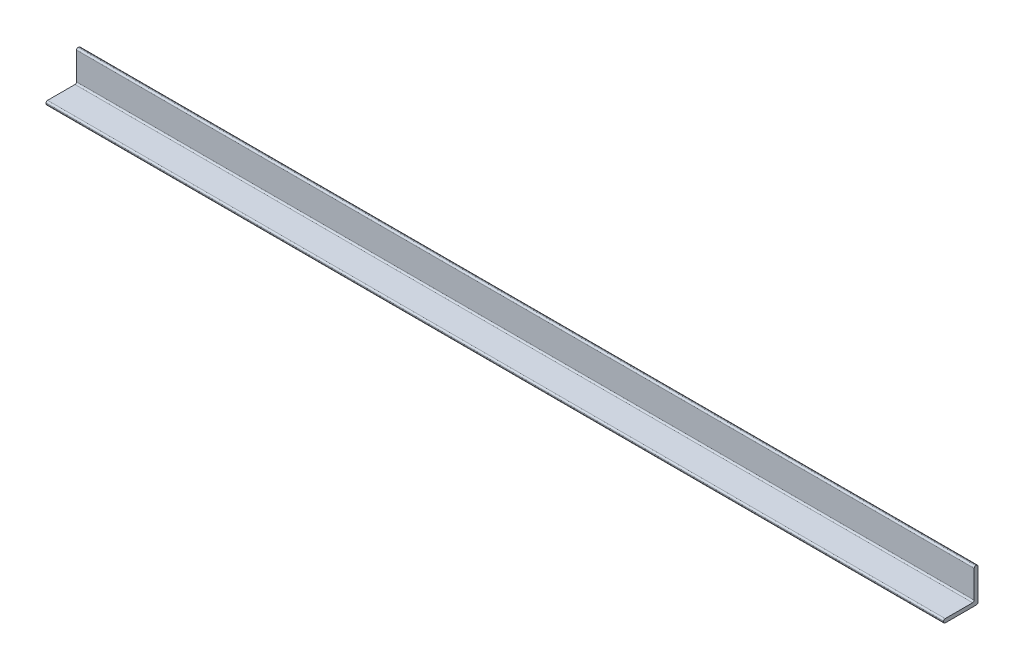
ISO-10303-21;
HEADER;
FILE_DESCRIPTION(('STEP AP214'),'2;1');
FILE_NAME('part.step','',(''),(''),'','','');
FILE_SCHEMA(('AUTOMOTIVE_DESIGN { 1 0 10303 214 1 1 1 1 }'));
ENDSEC;
DATA;
#1=APPLICATION_CONTEXT('core data for automotive mechanical design processes');
#2=APPLICATION_PROTOCOL_DEFINITION('international standard','automotive_design',2000,#1);
#3=PRODUCT_CONTEXT('',#1,'mechanical');
#4=PRODUCT('Part','Part','',(#3));
#5=PRODUCT_RELATED_PRODUCT_CATEGORY('part','',(#4));
#6=PRODUCT_DEFINITION_FORMATION('','',#4);
#7=PRODUCT_DEFINITION_CONTEXT('part definition',#1,'design');
#8=PRODUCT_DEFINITION('design','',#6,#7);
#9=PRODUCT_DEFINITION_SHAPE('','',#8);
#10=(LENGTH_UNIT() NAMED_UNIT(*) SI_UNIT(.MILLI.,.METRE.));
#11=(NAMED_UNIT(*) PLANE_ANGLE_UNIT() SI_UNIT($,.RADIAN.));
#12=(NAMED_UNIT(*) SI_UNIT($,.STERADIAN.) SOLID_ANGLE_UNIT());
#13=UNCERTAINTY_MEASURE_WITH_UNIT(LENGTH_MEASURE(1.E-05),#10,'distance_accuracy_value','');
#14=(GEOMETRIC_REPRESENTATION_CONTEXT(3) GLOBAL_UNCERTAINTY_ASSIGNED_CONTEXT((#13)) GLOBAL_UNIT_ASSIGNED_CONTEXT((#10,
#11,#12)) REPRESENTATION_CONTEXT('',''));
#15=CARTESIAN_POINT('',(0.,0.,0.));
#16=DIRECTION('',(0.,0.,1.));
#17=DIRECTION('',(1.,0.,0.));
#18=AXIS2_PLACEMENT_3D('',#15,#16,#17);
#19=CARTESIAN_POINT('',(294.,2.5,-11.25));
#20=DIRECTION('',(-1.,0.,0.));
#21=DIRECTION('',(0.,0.,1.));
#22=AXIS2_PLACEMENT_3D('',#19,#20,#21);
#23=PLANE('',#22);
#24=DIRECTION('',(0.,0.,-1.));
#25=VECTOR('',#24,1.);
#26=CARTESIAN_POINT('',(294.,0.,-11.25));
#27=LINE('',#26,#25);
#28=CARTESIAN_POINT('',(294.,0.,10.25));
#29=VERTEX_POINT('',#28);
#30=CARTESIAN_POINT('',(294.,0.,-10.25));
#31=VERTEX_POINT('',#30);
#32=EDGE_CURVE('E213',#29,#31,#27,.T.);
#33=ORIENTED_EDGE('',*,*,#32,.T.);
#34=CARTESIAN_POINT('',(294.,1.,-10.25));
#35=DIRECTION('',(-1.,0.,0.));
#36=DIRECTION('',(0.,0.,1.));
#37=AXIS2_PLACEMENT_3D('',#34,#35,#36);
#38=CIRCLE('',#37,1.);
#39=CARTESIAN_POINT('',(294.,1.,-11.25));
#40=VERTEX_POINT('',#39);
#41=EDGE_CURVE('E167',#31,#40,#38,.F.);
#42=ORIENTED_EDGE('',*,*,#41,.T.);
#43=DIRECTION('',(0.,-1.,0.));
#44=VECTOR('',#43,1.);
#45=CARTESIAN_POINT('',(294.,2.5,-11.25));
#46=LINE('',#45,#44);
#47=CARTESIAN_POINT('',(294.,21.5,-11.25));
#48=VERTEX_POINT('',#47);
#49=EDGE_CURVE('E142',#48,#40,#46,.T.);
#50=ORIENTED_EDGE('',*,*,#49,.F.);
#51=CARTESIAN_POINT('',(294.,21.5,-10.25));
#52=DIRECTION('',(-1.,0.,0.));
#53=DIRECTION('',(0.,0.,1.));
#54=AXIS2_PLACEMENT_3D('',#51,#52,#53);
#55=CIRCLE('',#54,1.);
#56=CARTESIAN_POINT('',(294.,22.5,-10.25));
#57=VERTEX_POINT('',#56);
#58=EDGE_CURVE('E146',#48,#57,#55,.F.);
#59=ORIENTED_EDGE('',*,*,#58,.T.);
#60=DIRECTION('',(0.,0.,-1.));
#61=VECTOR('',#60,1.);
#62=CARTESIAN_POINT('',(294.,22.5,-11.25));
#63=LINE('',#62,#61);
#64=CARTESIAN_POINT('',(294.,22.5,-9.75));
#65=VERTEX_POINT('',#64);
#66=EDGE_CURVE('E216',#65,#57,#63,.T.);
#67=ORIENTED_EDGE('',*,*,#66,.F.);
#68=CARTESIAN_POINT('',(294.,21.5,-9.75));
#69=DIRECTION('',(-1.,0.,0.));
#70=DIRECTION('',(0.,0.,1.));
#71=AXIS2_PLACEMENT_3D('',#68,#69,#70);
#72=CIRCLE('',#71,1.);
#73=CARTESIAN_POINT('',(294.,21.5,-8.75));
#74=VERTEX_POINT('',#73);
#75=EDGE_CURVE('E163',#65,#74,#72,.F.);
#76=ORIENTED_EDGE('',*,*,#75,.T.);
#77=DIRECTION('',(0.,-1.,0.));
#78=VECTOR('',#77,1.);
#79=CARTESIAN_POINT('',(294.,22.5,-8.75));
#80=LINE('',#79,#78);
#81=CARTESIAN_POINT('',(294.,3.5,-8.75));
#82=VERTEX_POINT('',#81);
#83=EDGE_CURVE('E192',#74,#82,#80,.T.);
#84=ORIENTED_EDGE('',*,*,#83,.T.);
#85=CARTESIAN_POINT('',(294.,3.5,-7.75));
#86=DIRECTION('',(-1.,0.,0.));
#87=DIRECTION('',(0.,0.,1.));
#88=AXIS2_PLACEMENT_3D('',#85,#86,#87);
#89=CIRCLE('',#88,1.);
#90=CARTESIAN_POINT('',(294.,2.5,-7.75));
#91=VERTEX_POINT('',#90);
#92=EDGE_CURVE('E40',#82,#91,#89,.T.);
#93=ORIENTED_EDGE('',*,*,#92,.T.);
#94=DIRECTION('',(0.,0.,-1.));
#95=VECTOR('',#94,1.);
#96=CARTESIAN_POINT('',(294.,2.5,-11.25));
#97=LINE('',#96,#95);
#98=CARTESIAN_POINT('',(294.,2.5,10.25));
#99=VERTEX_POINT('',#98);
#100=EDGE_CURVE('E190',#99,#91,#97,.T.);
#101=ORIENTED_EDGE('',*,*,#100,.F.);
#102=CARTESIAN_POINT('',(294.,1.5,10.25));
#103=DIRECTION('',(-1.,0.,0.));
#104=DIRECTION('',(0.,0.,1.));
#105=AXIS2_PLACEMENT_3D('',#102,#103,#104);
#106=CIRCLE('',#105,1.);
#107=CARTESIAN_POINT('',(294.,1.5,11.25));
#108=VERTEX_POINT('',#107);
#109=EDGE_CURVE('E55',#99,#108,#106,.F.);
#110=ORIENTED_EDGE('',*,*,#109,.T.);
#111=DIRECTION('',(0.,-1.,0.));
#112=VECTOR('',#111,1.);
#113=CARTESIAN_POINT('',(294.,2.5,11.25));
#114=LINE('',#113,#112);
#115=CARTESIAN_POINT('',(294.,1.,11.25));
#116=VERTEX_POINT('',#115);
#117=EDGE_CURVE('E220',#108,#116,#114,.T.);
#118=ORIENTED_EDGE('',*,*,#117,.T.);
#119=CARTESIAN_POINT('',(294.,1.,10.25));
#120=DIRECTION('',(-1.,0.,0.));
#121=DIRECTION('',(0.,0.,1.));
#122=AXIS2_PLACEMENT_3D('',#119,#120,#121);
#123=CIRCLE('',#122,1.);
#124=EDGE_CURVE('E47',#116,#29,#123,.F.);
#125=ORIENTED_EDGE('',*,*,#124,.T.);
#126=EDGE_LOOP('',(#33,#42,#50,#59,#67,#76,#84,#93,#101,#110,#118,#125));
#127=FACE_BOUND('',#126,.T.);
#128=ADVANCED_FACE('F32',(#127),#23,.F.);
#129=CARTESIAN_POINT('',(-294.,2.5,-11.25));
#130=DIRECTION('',(0.,0.,1.));
#131=DIRECTION('',(1.,0.,0.));
#132=AXIS2_PLACEMENT_3D('',#129,#130,#131);
#133=PLANE('',#132);
#134=ORIENTED_EDGE('',*,*,#49,.T.);
#135=DIRECTION('',(-1.,0.,0.));
#136=VECTOR('',#135,1.);
#137=CARTESIAN_POINT('',(-294.,1.,-11.25));
#138=LINE('',#137,#136);
#139=CARTESIAN_POINT('',(-294.,1.,-11.25));
#140=VERTEX_POINT('',#139);
#141=EDGE_CURVE('E133',#40,#140,#138,.T.);
#142=ORIENTED_EDGE('',*,*,#141,.T.);
#143=DIRECTION('',(0.,-1.,0.));
#144=VECTOR('',#143,1.);
#145=CARTESIAN_POINT('',(-294.,2.5,-11.25));
#146=LINE('',#145,#144);
#147=CARTESIAN_POINT('',(-294.,21.5,-11.25));
#148=VERTEX_POINT('',#147);
#149=EDGE_CURVE('E125',#148,#140,#146,.T.);
#150=ORIENTED_EDGE('',*,*,#149,.F.);
#151=DIRECTION('',(-1.,0.,0.));
#152=VECTOR('',#151,1.);
#153=CARTESIAN_POINT('',(294.,21.5,-11.25));
#154=LINE('',#153,#152);
#155=EDGE_CURVE('E139',#148,#48,#154,.F.);
#156=ORIENTED_EDGE('',*,*,#155,.T.);
#157=EDGE_LOOP('',(#134,#142,#150,#156));
#158=FACE_BOUND('',#157,.T.);
#159=ADVANCED_FACE('F138',(#158),#133,.F.);
#160=CARTESIAN_POINT('',(-294.,2.5,-11.25));
#161=DIRECTION('',(1.,0.,0.));
#162=DIRECTION('',(0.,0.,-1.));
#163=AXIS2_PLACEMENT_3D('',#160,#161,#162);
#164=PLANE('',#163);
#165=ORIENTED_EDGE('',*,*,#149,.T.);
#166=CARTESIAN_POINT('',(-294.,1.,-10.25));
#167=DIRECTION('',(1.,0.,0.));
#168=DIRECTION('',(0.,0.,-1.));
#169=AXIS2_PLACEMENT_3D('',#166,#167,#168);
#170=CIRCLE('',#169,1.);
#171=CARTESIAN_POINT('',(-294.,0.,-10.25));
#172=VERTEX_POINT('',#171);
#173=EDGE_CURVE('E156',#140,#172,#170,.F.);
#174=ORIENTED_EDGE('',*,*,#173,.T.);
#175=DIRECTION('',(0.,0.,1.));
#176=VECTOR('',#175,1.);
#177=CARTESIAN_POINT('',(-294.,0.,-11.25));
#178=LINE('',#177,#176);
#179=CARTESIAN_POINT('',(-294.,0.,10.25));
#180=VERTEX_POINT('',#179);
#181=EDGE_CURVE('E202',#172,#180,#178,.T.);
#182=ORIENTED_EDGE('',*,*,#181,.T.);
#183=CARTESIAN_POINT('',(-294.,1.,10.25));
#184=DIRECTION('',(1.,0.,0.));
#185=DIRECTION('',(0.,0.,-1.));
#186=AXIS2_PLACEMENT_3D('',#183,#184,#185);
#187=CIRCLE('',#186,1.);
#188=CARTESIAN_POINT('',(-294.,1.,11.25));
#189=VERTEX_POINT('',#188);
#190=EDGE_CURVE('E154',#180,#189,#187,.F.);
#191=ORIENTED_EDGE('',*,*,#190,.T.);
#192=DIRECTION('',(0.,-1.,0.));
#193=VECTOR('',#192,1.);
#194=CARTESIAN_POINT('',(-294.,2.5,11.25));
#195=LINE('',#194,#193);
#196=CARTESIAN_POINT('',(-294.,1.5,11.25));
#197=VERTEX_POINT('',#196);
#198=EDGE_CURVE('E143',#197,#189,#195,.T.);
#199=ORIENTED_EDGE('',*,*,#198,.F.);
#200=CARTESIAN_POINT('',(-294.,1.5,10.25));
#201=DIRECTION('',(1.,0.,0.));
#202=DIRECTION('',(0.,0.,-1.));
#203=AXIS2_PLACEMENT_3D('',#200,#201,#202);
#204=CIRCLE('',#203,1.);
#205=CARTESIAN_POINT('',(-294.,2.5,10.25));
#206=VERTEX_POINT('',#205);
#207=EDGE_CURVE('E152',#197,#206,#204,.F.);
#208=ORIENTED_EDGE('',*,*,#207,.T.);
#209=DIRECTION('',(0.,0.,1.));
#210=VECTOR('',#209,1.);
#211=CARTESIAN_POINT('',(-294.,2.5,-11.25));
#212=LINE('',#211,#210);
#213=CARTESIAN_POINT('',(-294.,2.5,-7.75));
#214=VERTEX_POINT('',#213);
#215=EDGE_CURVE('E201',#214,#206,#212,.T.);
#216=ORIENTED_EDGE('',*,*,#215,.F.);
#217=CARTESIAN_POINT('',(-294.,3.5,-7.75));
#218=DIRECTION('',(1.,0.,0.));
#219=DIRECTION('',(0.,0.,-1.));
#220=AXIS2_PLACEMENT_3D('',#217,#218,#219);
#221=CIRCLE('',#220,1.);
#222=CARTESIAN_POINT('',(-294.,3.5,-8.75));
#223=VERTEX_POINT('',#222);
#224=EDGE_CURVE('E11',#214,#223,#221,.T.);
#225=ORIENTED_EDGE('',*,*,#224,.T.);
#226=DIRECTION('',(0.,-1.,0.));
#227=VECTOR('',#226,1.);
#228=CARTESIAN_POINT('',(-294.,22.5,-8.75));
#229=LINE('',#228,#227);
#230=CARTESIAN_POINT('',(-294.,21.5,-8.75));
#231=VERTEX_POINT('',#230);
#232=EDGE_CURVE('E208',#231,#223,#229,.T.);
#233=ORIENTED_EDGE('',*,*,#232,.F.);
#234=CARTESIAN_POINT('',(-294.,21.5,-9.75));
#235=DIRECTION('',(1.,0.,0.));
#236=DIRECTION('',(0.,0.,-1.));
#237=AXIS2_PLACEMENT_3D('',#234,#235,#236);
#238=CIRCLE('',#237,1.);
#239=CARTESIAN_POINT('',(-294.,22.5,-9.75));
#240=VERTEX_POINT('',#239);
#241=EDGE_CURVE('E132',#231,#240,#238,.F.);
#242=ORIENTED_EDGE('',*,*,#241,.T.);
#243=DIRECTION('',(0.,0.,1.));
#244=VECTOR('',#243,1.);
#245=CARTESIAN_POINT('',(-294.,22.5,-11.25));
#246=LINE('',#245,#244);
#247=CARTESIAN_POINT('',(-294.,22.5,-10.25));
#248=VERTEX_POINT('',#247);
#249=EDGE_CURVE('E127',#248,#240,#246,.T.);
#250=ORIENTED_EDGE('',*,*,#249,.F.);
#251=CARTESIAN_POINT('',(-294.,21.5,-10.25));
#252=DIRECTION('',(1.,0.,0.));
#253=DIRECTION('',(0.,0.,-1.));
#254=AXIS2_PLACEMENT_3D('',#251,#252,#253);
#255=CIRCLE('',#254,1.);
#256=EDGE_CURVE('E122',#248,#148,#255,.F.);
#257=ORIENTED_EDGE('',*,*,#256,.T.);
#258=EDGE_LOOP('',(#165,#174,#182,#191,#199,#208,#216,#225,#233,#242,#250,#257));
#259=FACE_BOUND('',#258,.T.);
#260=ADVANCED_FACE('F124',(#259),#164,.F.);
#261=CARTESIAN_POINT('',(-294.,2.5,11.25));
#262=DIRECTION('',(0.,0.,-1.));
#263=DIRECTION('',(-1.,0.,0.));
#264=AXIS2_PLACEMENT_3D('',#261,#262,#263);
#265=PLANE('',#264);
#266=ORIENTED_EDGE('',*,*,#198,.T.);
#267=DIRECTION('',(1.,0.,0.));
#268=VECTOR('',#267,1.);
#269=CARTESIAN_POINT('',(-294.,1.,11.25));
#270=LINE('',#269,#268);
#271=EDGE_CURVE('E171',#189,#116,#270,.T.);
#272=ORIENTED_EDGE('',*,*,#271,.T.);
#273=ORIENTED_EDGE('',*,*,#117,.F.);
#274=DIRECTION('',(1.,0.,0.));
#275=VECTOR('',#274,1.);
#276=CARTESIAN_POINT('',(-294.,1.5,11.25));
#277=LINE('',#276,#275);
#278=EDGE_CURVE('E169',#108,#197,#277,.F.);
#279=ORIENTED_EDGE('',*,*,#278,.T.);
#280=EDGE_LOOP('',(#266,#272,#273,#279));
#281=FACE_BOUND('',#280,.T.);
#282=ADVANCED_FACE('F228',(#281),#265,.F.);
#283=CARTESIAN_POINT('',(0.,2.5,0.));
#284=DIRECTION('',(0.,1.,0.));
#285=DIRECTION('',(0.,0.,1.));
#286=AXIS2_PLACEMENT_3D('',#283,#284,#285);
#287=PLANE('',#286);
#288=ORIENTED_EDGE('',*,*,#215,.T.);
#289=DIRECTION('',(1.,0.,0.));
#290=VECTOR('',#289,1.);
#291=CARTESIAN_POINT('',(294.,2.5,10.25));
#292=LINE('',#291,#290);
#293=EDGE_CURVE('E175',#206,#99,#292,.T.);
#294=ORIENTED_EDGE('',*,*,#293,.T.);
#295=ORIENTED_EDGE('',*,*,#100,.T.);
#296=DIRECTION('',(1.,0.,0.));
#297=VECTOR('',#296,1.);
#298=CARTESIAN_POINT('',(0.,2.5,-7.75));
#299=LINE('',#298,#297);
#300=EDGE_CURVE('E173',#91,#214,#299,.F.);
#301=ORIENTED_EDGE('',*,*,#300,.T.);
#302=EDGE_LOOP('',(#288,#294,#295,#301));
#303=FACE_BOUND('',#302,.T.);
#304=ADVANCED_FACE('F198',(#303),#287,.T.);
#305=CARTESIAN_POINT('',(0.,0.,0.));
#306=DIRECTION('',(0.,1.,0.));
#307=DIRECTION('',(0.,0.,1.));
#308=AXIS2_PLACEMENT_3D('',#305,#306,#307);
#309=PLANE('',#308);
#310=ORIENTED_EDGE('',*,*,#181,.F.);
#311=DIRECTION('',(-1.,0.,0.));
#312=VECTOR('',#311,1.);
#313=CARTESIAN_POINT('',(0.,0.,-10.25));
#314=LINE('',#313,#312);
#315=EDGE_CURVE('E160',#172,#31,#314,.F.);
#316=ORIENTED_EDGE('',*,*,#315,.T.);
#317=ORIENTED_EDGE('',*,*,#32,.F.);
#318=DIRECTION('',(1.,0.,0.));
#319=VECTOR('',#318,1.);
#320=CARTESIAN_POINT('',(0.,0.,10.25));
#321=LINE('',#320,#319);
#322=EDGE_CURVE('E158',#29,#180,#321,.F.);
#323=ORIENTED_EDGE('',*,*,#322,.T.);
#324=EDGE_LOOP('',(#310,#316,#317,#323));
#325=FACE_BOUND('',#324,.T.);
#326=ADVANCED_FACE('F236',(#325),#309,.F.);
#327=CARTESIAN_POINT('',(-294.,22.5,-8.75));
#328=DIRECTION('',(0.,0.,-1.));
#329=DIRECTION('',(-1.,0.,0.));
#330=AXIS2_PLACEMENT_3D('',#327,#328,#329);
#331=PLANE('',#330);
#332=ORIENTED_EDGE('',*,*,#232,.T.);
#333=DIRECTION('',(1.,0.,0.));
#334=VECTOR('',#333,1.);
#335=CARTESIAN_POINT('',(-294.,3.5,-8.75));
#336=LINE('',#335,#334);
#337=EDGE_CURVE('E180',#223,#82,#336,.T.);
#338=ORIENTED_EDGE('',*,*,#337,.T.);
#339=ORIENTED_EDGE('',*,*,#83,.F.);
#340=DIRECTION('',(1.,0.,0.));
#341=VECTOR('',#340,1.);
#342=CARTESIAN_POINT('',(-294.,21.5,-8.75));
#343=LINE('',#342,#341);
#344=EDGE_CURVE('E178',#74,#231,#343,.F.);
#345=ORIENTED_EDGE('',*,*,#344,.T.);
#346=EDGE_LOOP('',(#332,#338,#339,#345));
#347=FACE_BOUND('',#346,.T.);
#348=ADVANCED_FACE('F211',(#347),#331,.F.);
#349=CARTESIAN_POINT('',(0.,22.5,0.));
#350=DIRECTION('',(0.,1.,0.));
#351=DIRECTION('',(0.,0.,1.));
#352=AXIS2_PLACEMENT_3D('',#349,#350,#351);
#353=PLANE('',#352);
#354=ORIENTED_EDGE('',*,*,#249,.T.);
#355=DIRECTION('',(1.,0.,0.));
#356=VECTOR('',#355,1.);
#357=CARTESIAN_POINT('',(294.,22.5,-9.75));
#358=LINE('',#357,#356);
#359=EDGE_CURVE('E185',#240,#65,#358,.T.);
#360=ORIENTED_EDGE('',*,*,#359,.T.);
#361=ORIENTED_EDGE('',*,*,#66,.T.);
#362=DIRECTION('',(-1.,0.,0.));
#363=VECTOR('',#362,1.);
#364=CARTESIAN_POINT('',(-294.,22.5,-10.25));
#365=LINE('',#364,#363);
#366=EDGE_CURVE('E183',#57,#248,#365,.T.);
#367=ORIENTED_EDGE('',*,*,#366,.T.);
#368=EDGE_LOOP('',(#354,#360,#361,#367));
#369=FACE_BOUND('',#368,.T.);
#370=ADVANCED_FACE('F261',(#369),#353,.T.);
#371=CARTESIAN_POINT('',(-294.,1.,-10.25));
#372=DIRECTION('',(-1.,0.,0.));
#373=DIRECTION('',(0.,0.,1.));
#374=AXIS2_PLACEMENT_3D('',#371,#372,#373);
#375=CYLINDRICAL_SURFACE('',#374,1.);
#376=ORIENTED_EDGE('',*,*,#41,.F.);
#377=ORIENTED_EDGE('',*,*,#315,.F.);
#378=ORIENTED_EDGE('',*,*,#173,.F.);
#379=ORIENTED_EDGE('',*,*,#141,.F.);
#380=EDGE_LOOP('',(#376,#377,#378,#379));
#381=FACE_BOUND('',#380,.T.);
#382=ADVANCED_FACE('F240',(#381),#375,.T.);
#383=CARTESIAN_POINT('',(-294.,1.,10.25));
#384=DIRECTION('',(1.,0.,0.));
#385=DIRECTION('',(0.,0.,-1.));
#386=AXIS2_PLACEMENT_3D('',#383,#384,#385);
#387=CYLINDRICAL_SURFACE('',#386,1.);
#388=ORIENTED_EDGE('',*,*,#190,.F.);
#389=ORIENTED_EDGE('',*,*,#322,.F.);
#390=ORIENTED_EDGE('',*,*,#124,.F.);
#391=ORIENTED_EDGE('',*,*,#271,.F.);
#392=EDGE_LOOP('',(#388,#389,#390,#391));
#393=FACE_BOUND('',#392,.T.);
#394=ADVANCED_FACE('F232',(#393),#387,.T.);
#395=CARTESIAN_POINT('',(0.,1.5,10.25));
#396=DIRECTION('',(-1.,0.,0.));
#397=DIRECTION('',(0.,0.,1.));
#398=AXIS2_PLACEMENT_3D('',#395,#396,#397);
#399=CYLINDRICAL_SURFACE('',#398,1.);
#400=ORIENTED_EDGE('',*,*,#207,.F.);
#401=ORIENTED_EDGE('',*,*,#278,.F.);
#402=ORIENTED_EDGE('',*,*,#109,.F.);
#403=ORIENTED_EDGE('',*,*,#293,.F.);
#404=EDGE_LOOP('',(#400,#401,#402,#403));
#405=FACE_BOUND('',#404,.T.);
#406=ADVANCED_FACE('F242',(#405),#399,.T.);
#407=CARTESIAN_POINT('',(-294.,3.5,-7.75));
#408=DIRECTION('',(1.,0.,0.));
#409=DIRECTION('',(0.,0.,-1.));
#410=AXIS2_PLACEMENT_3D('',#407,#408,#409);
#411=CYLINDRICAL_SURFACE('',#410,1.);
#412=ORIENTED_EDGE('',*,*,#224,.F.);
#413=ORIENTED_EDGE('',*,*,#300,.F.);
#414=ORIENTED_EDGE('',*,*,#92,.F.);
#415=ORIENTED_EDGE('',*,*,#337,.F.);
#416=EDGE_LOOP('',(#412,#413,#414,#415));
#417=FACE_BOUND('',#416,.T.);
#418=ADVANCED_FACE('F205',(#417),#411,.F.);
#419=CARTESIAN_POINT('',(0.,21.5,-9.75));
#420=DIRECTION('',(-1.,0.,0.));
#421=DIRECTION('',(0.,0.,1.));
#422=AXIS2_PLACEMENT_3D('',#419,#420,#421);
#423=CYLINDRICAL_SURFACE('',#422,1.);
#424=ORIENTED_EDGE('',*,*,#241,.F.);
#425=ORIENTED_EDGE('',*,*,#344,.F.);
#426=ORIENTED_EDGE('',*,*,#75,.F.);
#427=ORIENTED_EDGE('',*,*,#359,.F.);
#428=EDGE_LOOP('',(#424,#425,#426,#427));
#429=FACE_BOUND('',#428,.T.);
#430=ADVANCED_FACE('F249',(#429),#423,.T.);
#431=CARTESIAN_POINT('',(0.,21.5,-10.25));
#432=DIRECTION('',(1.,0.,0.));
#433=DIRECTION('',(0.,0.,-1.));
#434=AXIS2_PLACEMENT_3D('',#431,#432,#433);
#435=CYLINDRICAL_SURFACE('',#434,1.);
#436=ORIENTED_EDGE('',*,*,#58,.F.);
#437=ORIENTED_EDGE('',*,*,#155,.F.);
#438=ORIENTED_EDGE('',*,*,#256,.F.);
#439=ORIENTED_EDGE('',*,*,#366,.F.);
#440=EDGE_LOOP('',(#436,#437,#438,#439));
#441=FACE_BOUND('',#440,.T.);
#442=ADVANCED_FACE('F34',(#441),#435,.T.);
#443=CLOSED_SHELL('',(#128,#159,#260,#282,#304,#326,#348,#370,#382,#394,#406,#418,#430,#442));
#444=MANIFOLD_SOLID_BREP('B2',#443);
#445=ADVANCED_BREP_SHAPE_REPRESENTATION('',(#18,#444),#14);
#446=SHAPE_DEFINITION_REPRESENTATION(#9,#445);
ENDSEC;
END-ISO-10303-21;
